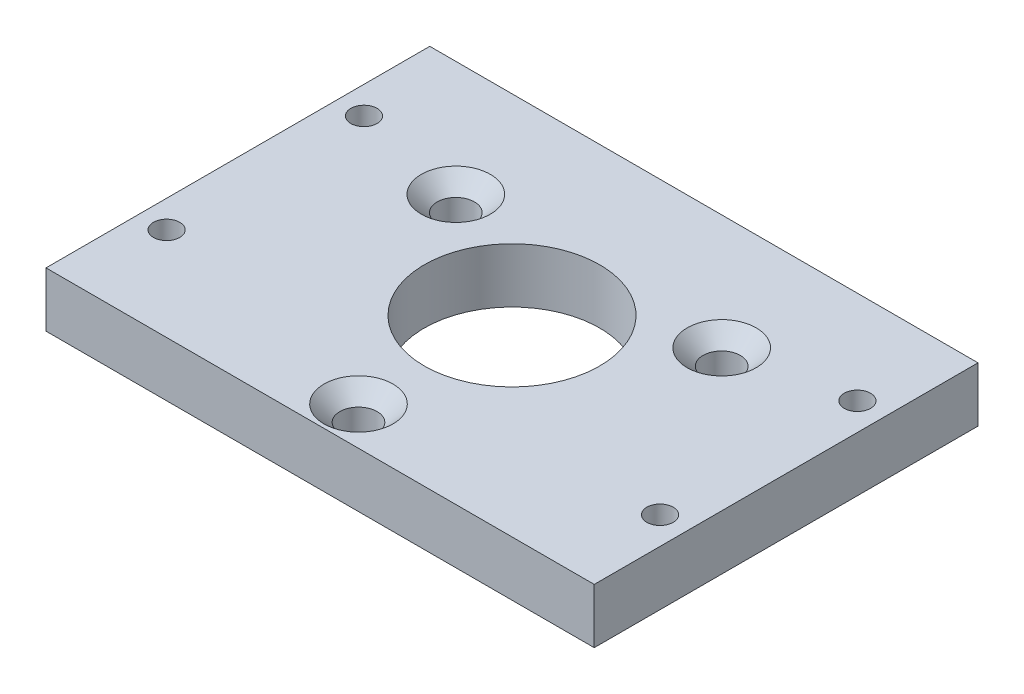
ISO-10303-21;
HEADER;
FILE_DESCRIPTION(('STEP AP214'),'2;1');
FILE_NAME('part.step','',(''),(''),'','','');
FILE_SCHEMA(('AUTOMOTIVE_DESIGN { 1 0 10303 214 1 1 1 1 }'));
ENDSEC;
DATA;
#1=APPLICATION_CONTEXT('core data for automotive mechanical design processes');
#2=APPLICATION_PROTOCOL_DEFINITION('international standard','automotive_design',2000,#1);
#3=PRODUCT_CONTEXT('',#1,'mechanical');
#4=PRODUCT('Part','Part','',(#3));
#5=PRODUCT_RELATED_PRODUCT_CATEGORY('part','',(#4));
#6=PRODUCT_DEFINITION_FORMATION('','',#4);
#7=PRODUCT_DEFINITION_CONTEXT('part definition',#1,'design');
#8=PRODUCT_DEFINITION('design','',#6,#7);
#9=PRODUCT_DEFINITION_SHAPE('','',#8);
#10=(LENGTH_UNIT() NAMED_UNIT(*) SI_UNIT(.MILLI.,.METRE.));
#11=(NAMED_UNIT(*) PLANE_ANGLE_UNIT() SI_UNIT($,.RADIAN.));
#12=(NAMED_UNIT(*) SI_UNIT($,.STERADIAN.) SOLID_ANGLE_UNIT());
#13=UNCERTAINTY_MEASURE_WITH_UNIT(LENGTH_MEASURE(1.E-05),#10,'distance_accuracy_value','');
#14=(GEOMETRIC_REPRESENTATION_CONTEXT(3) GLOBAL_UNCERTAINTY_ASSIGNED_CONTEXT((#13)) GLOBAL_UNIT_ASSIGNED_CONTEXT((#10,
#11,#12)) REPRESENTATION_CONTEXT('',''));
#15=CARTESIAN_POINT('',(0.,0.,0.));
#16=DIRECTION('',(0.,0.,1.));
#17=DIRECTION('',(1.,0.,0.));
#18=AXIS2_PLACEMENT_3D('',#15,#16,#17);
#19=CARTESIAN_POINT('',(0.,5.,0.));
#20=DIRECTION('',(0.,1.,0.));
#21=DIRECTION('',(0.,0.,1.));
#22=AXIS2_PLACEMENT_3D('',#19,#20,#21);
#23=PLANE('',#22);
#24=CARTESIAN_POINT('',(-22.5,5.,9.));
#25=DIRECTION('',(0.,-1.,0.));
#26=DIRECTION('',(0.,0.,-1.));
#27=AXIS2_PLACEMENT_3D('',#24,#25,#26);
#28=CIRCLE('',#27,1.2);
#29=CARTESIAN_POINT('',(-22.5,5.,7.8));
#30=VERTEX_POINT('',#29);
#31=EDGE_CURVE('E186',#30,#30,#28,.T.);
#32=ORIENTED_EDGE('',*,*,#31,.T.);
#33=EDGE_LOOP('',(#32));
#34=FACE_BOUND('',#33,.T.);
#35=CARTESIAN_POINT('',(-22.5,5.,-9.));
#36=DIRECTION('',(0.,-1.,0.));
#37=DIRECTION('',(0.,0.,-1.));
#38=AXIS2_PLACEMENT_3D('',#35,#36,#37);
#39=CIRCLE('',#38,1.2);
#40=CARTESIAN_POINT('',(-22.5,5.,-10.2));
#41=VERTEX_POINT('',#40);
#42=EDGE_CURVE('E177',#41,#41,#39,.T.);
#43=ORIENTED_EDGE('',*,*,#42,.T.);
#44=EDGE_LOOP('',(#43));
#45=FACE_BOUND('',#44,.T.);
#46=CARTESIAN_POINT('',(22.5,5.,-9.));
#47=DIRECTION('',(0.,-1.,0.));
#48=DIRECTION('',(0.,0.,-1.));
#49=AXIS2_PLACEMENT_3D('',#46,#47,#48);
#50=CIRCLE('',#49,1.2);
#51=CARTESIAN_POINT('',(22.5,5.,-10.2));
#52=VERTEX_POINT('',#51);
#53=EDGE_CURVE('E168',#52,#52,#50,.T.);
#54=ORIENTED_EDGE('',*,*,#53,.T.);
#55=EDGE_LOOP('',(#54));
#56=FACE_BOUND('',#55,.T.);
#57=CARTESIAN_POINT('',(22.5,5.,9.));
#58=DIRECTION('',(0.,-1.,0.));
#59=DIRECTION('',(0.,0.,-1.));
#60=AXIS2_PLACEMENT_3D('',#57,#58,#59);
#61=CIRCLE('',#60,1.2);
#62=CARTESIAN_POINT('',(22.5,5.,7.8));
#63=VERTEX_POINT('',#62);
#64=EDGE_CURVE('E159',#63,#63,#61,.T.);
#65=ORIENTED_EDGE('',*,*,#64,.T.);
#66=EDGE_LOOP('',(#65));
#67=FACE_BOUND('',#66,.T.);
#68=CARTESIAN_POINT('',(12.1243556529821,5.,-7.00000000000002));
#69=DIRECTION('',(0.,1.,0.));
#70=DIRECTION('',(0.,0.,1.));
#71=AXIS2_PLACEMENT_3D('',#68,#69,#70);
#72=CIRCLE('',#71,3.15);
#73=CARTESIAN_POINT('',(12.1243556529821,5.,-3.85000000000002));
#74=VERTEX_POINT('',#73);
#75=EDGE_CURVE('E156',#74,#74,#72,.T.);
#76=ORIENTED_EDGE('',*,*,#75,.F.);
#77=EDGE_LOOP('',(#76));
#78=FACE_BOUND('',#77,.T.);
#79=CARTESIAN_POINT('',(1.05644659686988E-12,5.,14.));
#80=DIRECTION('',(0.,1.,0.));
#81=DIRECTION('',(0.,0.,1.));
#82=AXIS2_PLACEMENT_3D('',#79,#80,#81);
#83=CIRCLE('',#82,3.15);
#84=CARTESIAN_POINT('',(1.05644659686988E-12,5.,17.15));
#85=VERTEX_POINT('',#84);
#86=EDGE_CURVE('E147',#85,#85,#83,.T.);
#87=ORIENTED_EDGE('',*,*,#86,.F.);
#88=EDGE_LOOP('',(#87));
#89=FACE_BOUND('',#88,.T.);
#90=CARTESIAN_POINT('',(-12.1243556529817,5.,-6.99999999999909));
#91=DIRECTION('',(0.,1.,0.));
#92=DIRECTION('',(0.,0.,1.));
#93=AXIS2_PLACEMENT_3D('',#90,#91,#92);
#94=CIRCLE('',#93,3.15);
#95=CARTESIAN_POINT('',(-12.1243556529817,5.,-3.84999999999909));
#96=VERTEX_POINT('',#95);
#97=EDGE_CURVE('E138',#96,#96,#94,.T.);
#98=ORIENTED_EDGE('',*,*,#97,.F.);
#99=EDGE_LOOP('',(#98));
#100=FACE_BOUND('',#99,.T.);
#101=DIRECTION('',(0.,0.,1.));
#102=VECTOR('',#101,1.);
#103=CARTESIAN_POINT('',(-25.,5.,17.5));
#104=LINE('',#103,#102);
#105=CARTESIAN_POINT('',(-25.,5.,-17.5));
#106=VERTEX_POINT('',#105);
#107=CARTESIAN_POINT('',(-25.,5.,17.5));
#108=VERTEX_POINT('',#107);
#109=EDGE_CURVE('E100',#106,#108,#104,.T.);
#110=ORIENTED_EDGE('',*,*,#109,.T.);
#111=DIRECTION('',(1.,0.,0.));
#112=VECTOR('',#111,1.);
#113=CARTESIAN_POINT('',(25.,5.,17.5));
#114=LINE('',#113,#112);
#115=CARTESIAN_POINT('',(25.,5.,17.5));
#116=VERTEX_POINT('',#115);
#117=EDGE_CURVE('E95',#108,#116,#114,.T.);
#118=ORIENTED_EDGE('',*,*,#117,.T.);
#119=DIRECTION('',(0.,0.,-1.));
#120=VECTOR('',#119,1.);
#121=CARTESIAN_POINT('',(25.,5.,17.5));
#122=LINE('',#121,#120);
#123=CARTESIAN_POINT('',(25.,5.,-17.5));
#124=VERTEX_POINT('',#123);
#125=EDGE_CURVE('E98',#116,#124,#122,.T.);
#126=ORIENTED_EDGE('',*,*,#125,.T.);
#127=DIRECTION('',(-1.,0.,0.));
#128=VECTOR('',#127,1.);
#129=CARTESIAN_POINT('',(25.,5.,-17.5));
#130=LINE('',#129,#128);
#131=EDGE_CURVE('E65',#124,#106,#130,.T.);
#132=ORIENTED_EDGE('',*,*,#131,.T.);
#133=EDGE_LOOP('',(#110,#118,#126,#132));
#134=FACE_BOUND('',#133,.T.);
#135=CARTESIAN_POINT('',(0.,5.,0.));
#136=DIRECTION('',(0.,1.,0.));
#137=DIRECTION('',(0.,0.,1.));
#138=AXIS2_PLACEMENT_3D('',#135,#136,#137);
#139=CIRCLE('',#138,8.);
#140=CARTESIAN_POINT('',(0.,5.,8.));
#141=VERTEX_POINT('',#140);
#142=EDGE_CURVE('E115',#141,#141,#139,.T.);
#143=ORIENTED_EDGE('',*,*,#142,.F.);
#144=EDGE_LOOP('',(#143));
#145=FACE_BOUND('',#144,.T.);
#146=ADVANCED_FACE('F48',(#34,#45,#56,#67,#78,#89,#100,#134,#145),#23,.T.);
#147=CARTESIAN_POINT('',(0.,0.,0.));
#148=DIRECTION('',(0.,1.,0.));
#149=DIRECTION('',(0.,0.,1.));
#150=AXIS2_PLACEMENT_3D('',#147,#148,#149);
#151=PLANE('',#150);
#152=CARTESIAN_POINT('',(-22.5,0.,9.));
#153=DIRECTION('',(0.,-1.,0.));
#154=DIRECTION('',(0.,0.,-1.));
#155=AXIS2_PLACEMENT_3D('',#152,#153,#154);
#156=CIRCLE('',#155,2.2);
#157=CARTESIAN_POINT('',(-22.5,0.,6.8));
#158=VERTEX_POINT('',#157);
#159=EDGE_CURVE('E192',#158,#158,#156,.T.);
#160=ORIENTED_EDGE('',*,*,#159,.F.);
#161=EDGE_LOOP('',(#160));
#162=FACE_BOUND('',#161,.T.);
#163=CARTESIAN_POINT('',(-22.5,0.,-9.));
#164=DIRECTION('',(0.,-1.,0.));
#165=DIRECTION('',(0.,0.,-1.));
#166=AXIS2_PLACEMENT_3D('',#163,#164,#165);
#167=CIRCLE('',#166,2.2);
#168=CARTESIAN_POINT('',(-22.5,0.,-11.2));
#169=VERTEX_POINT('',#168);
#170=EDGE_CURVE('E183',#169,#169,#167,.T.);
#171=ORIENTED_EDGE('',*,*,#170,.F.);
#172=EDGE_LOOP('',(#171));
#173=FACE_BOUND('',#172,.T.);
#174=CARTESIAN_POINT('',(22.5,0.,-9.));
#175=DIRECTION('',(0.,-1.,0.));
#176=DIRECTION('',(0.,0.,-1.));
#177=AXIS2_PLACEMENT_3D('',#174,#175,#176);
#178=CIRCLE('',#177,2.2);
#179=CARTESIAN_POINT('',(22.5,0.,-11.2));
#180=VERTEX_POINT('',#179);
#181=EDGE_CURVE('E174',#180,#180,#178,.T.);
#182=ORIENTED_EDGE('',*,*,#181,.F.);
#183=EDGE_LOOP('',(#182));
#184=FACE_BOUND('',#183,.T.);
#185=CARTESIAN_POINT('',(22.5,0.,9.));
#186=DIRECTION('',(0.,-1.,0.));
#187=DIRECTION('',(0.,0.,-1.));
#188=AXIS2_PLACEMENT_3D('',#185,#186,#187);
#189=CIRCLE('',#188,2.2);
#190=CARTESIAN_POINT('',(22.5,0.,6.8));
#191=VERTEX_POINT('',#190);
#192=EDGE_CURVE('E165',#191,#191,#189,.T.);
#193=ORIENTED_EDGE('',*,*,#192,.F.);
#194=EDGE_LOOP('',(#193));
#195=FACE_BOUND('',#194,.T.);
#196=CARTESIAN_POINT('',(12.1243556529821,0.,-7.00000000000002));
#197=DIRECTION('',(0.,1.,0.));
#198=DIRECTION('',(0.,0.,1.));
#199=AXIS2_PLACEMENT_3D('',#196,#197,#198);
#200=CIRCLE('',#199,1.7);
#201=CARTESIAN_POINT('',(12.1243556529821,0.,-5.30000000000003));
#202=VERTEX_POINT('',#201);
#203=EDGE_CURVE('E150',#202,#202,#200,.T.);
#204=ORIENTED_EDGE('',*,*,#203,.T.);
#205=EDGE_LOOP('',(#204));
#206=FACE_BOUND('',#205,.T.);
#207=CARTESIAN_POINT('',(1.05644659686988E-12,0.,14.));
#208=DIRECTION('',(0.,1.,0.));
#209=DIRECTION('',(0.,0.,1.));
#210=AXIS2_PLACEMENT_3D('',#207,#208,#209);
#211=CIRCLE('',#210,1.7);
#212=CARTESIAN_POINT('',(1.05644659686988E-12,0.,15.7));
#213=VERTEX_POINT('',#212);
#214=EDGE_CURVE('E141',#213,#213,#211,.T.);
#215=ORIENTED_EDGE('',*,*,#214,.T.);
#216=EDGE_LOOP('',(#215));
#217=FACE_BOUND('',#216,.T.);
#218=CARTESIAN_POINT('',(-12.1243556529817,0.,-6.99999999999909));
#219=DIRECTION('',(0.,1.,0.));
#220=DIRECTION('',(0.,0.,1.));
#221=AXIS2_PLACEMENT_3D('',#218,#219,#220);
#222=CIRCLE('',#221,1.7);
#223=CARTESIAN_POINT('',(-12.1243556529817,0.,-5.2999999999991));
#224=VERTEX_POINT('',#223);
#225=EDGE_CURVE('E130',#224,#224,#222,.T.);
#226=ORIENTED_EDGE('',*,*,#225,.T.);
#227=EDGE_LOOP('',(#226));
#228=FACE_BOUND('',#227,.T.);
#229=DIRECTION('',(0.,0.,1.));
#230=VECTOR('',#229,1.);
#231=CARTESIAN_POINT('',(-25.,0.,17.5));
#232=LINE('',#231,#230);
#233=CARTESIAN_POINT('',(-25.,0.,-17.5));
#234=VERTEX_POINT('',#233);
#235=CARTESIAN_POINT('',(-25.,0.,17.5));
#236=VERTEX_POINT('',#235);
#237=EDGE_CURVE('E112',#234,#236,#232,.T.);
#238=ORIENTED_EDGE('',*,*,#237,.F.);
#239=DIRECTION('',(-1.,0.,0.));
#240=VECTOR('',#239,1.);
#241=CARTESIAN_POINT('',(25.,0.,-17.5));
#242=LINE('',#241,#240);
#243=CARTESIAN_POINT('',(25.,0.,-17.5));
#244=VERTEX_POINT('',#243);
#245=EDGE_CURVE('E88',#244,#234,#242,.T.);
#246=ORIENTED_EDGE('',*,*,#245,.F.);
#247=DIRECTION('',(0.,0.,-1.));
#248=VECTOR('',#247,1.);
#249=CARTESIAN_POINT('',(25.,0.,17.5));
#250=LINE('',#249,#248);
#251=CARTESIAN_POINT('',(25.,0.,17.5));
#252=VERTEX_POINT('',#251);
#253=EDGE_CURVE('E82',#252,#244,#250,.T.);
#254=ORIENTED_EDGE('',*,*,#253,.F.);
#255=DIRECTION('',(1.,0.,0.));
#256=VECTOR('',#255,1.);
#257=CARTESIAN_POINT('',(25.,0.,17.5));
#258=LINE('',#257,#256);
#259=EDGE_CURVE('E104',#236,#252,#258,.T.);
#260=ORIENTED_EDGE('',*,*,#259,.F.);
#261=EDGE_LOOP('',(#238,#246,#254,#260));
#262=FACE_BOUND('',#261,.T.);
#263=CARTESIAN_POINT('',(0.,0.,0.));
#264=DIRECTION('',(0.,1.,0.));
#265=DIRECTION('',(0.,0.,1.));
#266=AXIS2_PLACEMENT_3D('',#263,#264,#265);
#267=CIRCLE('',#266,8.);
#268=CARTESIAN_POINT('',(0.,0.,8.));
#269=VERTEX_POINT('',#268);
#270=EDGE_CURVE('E127',#269,#269,#267,.T.);
#271=ORIENTED_EDGE('',*,*,#270,.T.);
#272=EDGE_LOOP('',(#271));
#273=FACE_BOUND('',#272,.T.);
#274=ADVANCED_FACE('F123',(#162,#173,#184,#195,#206,#217,#228,#262,#273),#151,.F.);
#275=CARTESIAN_POINT('',(-25.,5.,17.5));
#276=DIRECTION('',(1.,0.,0.));
#277=DIRECTION('',(0.,0.,-1.));
#278=AXIS2_PLACEMENT_3D('',#275,#276,#277);
#279=PLANE('',#278);
#280=ORIENTED_EDGE('',*,*,#237,.T.);
#281=DIRECTION('',(0.,-1.,0.));
#282=VECTOR('',#281,1.);
#283=CARTESIAN_POINT('',(-25.,5.,17.5));
#284=LINE('',#283,#282);
#285=EDGE_CURVE('E13',#108,#236,#284,.T.);
#286=ORIENTED_EDGE('',*,*,#285,.F.);
#287=ORIENTED_EDGE('',*,*,#109,.F.);
#288=DIRECTION('',(0.,-1.,0.));
#289=VECTOR('',#288,1.);
#290=CARTESIAN_POINT('',(-25.,5.,-17.5));
#291=LINE('',#290,#289);
#292=EDGE_CURVE('E108',#106,#234,#291,.T.);
#293=ORIENTED_EDGE('',*,*,#292,.T.);
#294=EDGE_LOOP('',(#280,#286,#287,#293));
#295=FACE_BOUND('',#294,.T.);
#296=ADVANCED_FACE('F50',(#295),#279,.F.);
#297=CARTESIAN_POINT('',(25.,5.,17.5));
#298=DIRECTION('',(0.,0.,-1.));
#299=DIRECTION('',(-1.,0.,0.));
#300=AXIS2_PLACEMENT_3D('',#297,#298,#299);
#301=PLANE('',#300);
#302=ORIENTED_EDGE('',*,*,#259,.T.);
#303=DIRECTION('',(0.,-1.,0.));
#304=VECTOR('',#303,1.);
#305=CARTESIAN_POINT('',(25.,5.,17.5));
#306=LINE('',#305,#304);
#307=EDGE_CURVE('E57',#116,#252,#306,.T.);
#308=ORIENTED_EDGE('',*,*,#307,.F.);
#309=ORIENTED_EDGE('',*,*,#117,.F.);
#310=ORIENTED_EDGE('',*,*,#285,.T.);
#311=EDGE_LOOP('',(#302,#308,#309,#310));
#312=FACE_BOUND('',#311,.T.);
#313=ADVANCED_FACE('F103',(#312),#301,.F.);
#314=CARTESIAN_POINT('',(25.,5.,17.5));
#315=DIRECTION('',(-1.,0.,0.));
#316=DIRECTION('',(0.,0.,1.));
#317=AXIS2_PLACEMENT_3D('',#314,#315,#316);
#318=PLANE('',#317);
#319=ORIENTED_EDGE('',*,*,#253,.T.);
#320=DIRECTION('',(0.,-1.,0.));
#321=VECTOR('',#320,1.);
#322=CARTESIAN_POINT('',(25.,5.,-17.5));
#323=LINE('',#322,#321);
#324=EDGE_CURVE('E105',#124,#244,#323,.T.);
#325=ORIENTED_EDGE('',*,*,#324,.F.);
#326=ORIENTED_EDGE('',*,*,#125,.F.);
#327=ORIENTED_EDGE('',*,*,#307,.T.);
#328=EDGE_LOOP('',(#319,#325,#326,#327));
#329=FACE_BOUND('',#328,.T.);
#330=ADVANCED_FACE('F106',(#329),#318,.F.);
#331=CARTESIAN_POINT('',(25.,5.,-17.5));
#332=DIRECTION('',(0.,0.,1.));
#333=DIRECTION('',(1.,0.,0.));
#334=AXIS2_PLACEMENT_3D('',#331,#332,#333);
#335=PLANE('',#334);
#336=ORIENTED_EDGE('',*,*,#245,.T.);
#337=ORIENTED_EDGE('',*,*,#292,.F.);
#338=ORIENTED_EDGE('',*,*,#131,.F.);
#339=ORIENTED_EDGE('',*,*,#324,.T.);
#340=EDGE_LOOP('',(#336,#337,#338,#339));
#341=FACE_BOUND('',#340,.T.);
#342=ADVANCED_FACE('F120',(#341),#335,.F.);
#343=CARTESIAN_POINT('',(0.,5.,0.));
#344=DIRECTION('',(0.,-1.,0.));
#345=DIRECTION('',(0.,0.,-1.));
#346=AXIS2_PLACEMENT_3D('',#343,#344,#345);
#347=CYLINDRICAL_SURFACE('',#346,8.);
#348=ORIENTED_EDGE('',*,*,#142,.T.);
#349=EDGE_LOOP('',(#348));
#350=FACE_BOUND('',#349,.T.);
#351=ORIENTED_EDGE('',*,*,#270,.F.);
#352=EDGE_LOOP('',(#351));
#353=FACE_BOUND('',#352,.T.);
#354=ADVANCED_FACE('F217',(#350,#353),#347,.F.);
#355=CARTESIAN_POINT('',(-12.1243556529817,5.,-6.99999999999909));
#356=DIRECTION('',(0.,1.,0.));
#357=DIRECTION('',(0.,0.,1.));
#358=AXIS2_PLACEMENT_3D('',#355,#356,#357);
#359=CYLINDRICAL_SURFACE('',#358,1.7);
#360=ORIENTED_EDGE('',*,*,#225,.F.);
#361=EDGE_LOOP('',(#360));
#362=FACE_BOUND('',#361,.T.);
#363=CARTESIAN_POINT('',(-12.1243556529817,3.55,-6.99999999999909));
#364=DIRECTION('',(0.,1.,0.));
#365=DIRECTION('',(0.,0.,1.));
#366=AXIS2_PLACEMENT_3D('',#363,#364,#365);
#367=CIRCLE('',#366,1.7);
#368=CARTESIAN_POINT('',(-12.1243556529817,3.55,-5.29999999999909));
#369=VERTEX_POINT('',#368);
#370=EDGE_CURVE('E135',#369,#369,#367,.T.);
#371=ORIENTED_EDGE('',*,*,#370,.T.);
#372=EDGE_LOOP('',(#371));
#373=FACE_BOUND('',#372,.T.);
#374=ADVANCED_FACE('F213',(#362,#373),#359,.F.);
#375=CARTESIAN_POINT('',(-12.1243556529817,5.,-6.99999999999909));
#376=DIRECTION('',(0.,1.,0.));
#377=DIRECTION('',(0.,0.,1.));
#378=AXIS2_PLACEMENT_3D('',#375,#376,#377);
#379=CONICAL_SURFACE('',#378,3.15,0.785398163397449);
#380=ORIENTED_EDGE('',*,*,#370,.F.);
#381=EDGE_LOOP('',(#380));
#382=FACE_BOUND('',#381,.T.);
#383=ORIENTED_EDGE('',*,*,#97,.T.);
#384=EDGE_LOOP('',(#383));
#385=FACE_BOUND('',#384,.T.);
#386=ADVANCED_FACE('F216',(#382,#385),#379,.F.);
#387=CARTESIAN_POINT('',(1.05644659686988E-12,5.,14.));
#388=DIRECTION('',(0.,1.,0.));
#389=DIRECTION('',(0.,0.,1.));
#390=AXIS2_PLACEMENT_3D('',#387,#388,#389);
#391=CYLINDRICAL_SURFACE('',#390,1.7);
#392=ORIENTED_EDGE('',*,*,#214,.F.);
#393=EDGE_LOOP('',(#392));
#394=FACE_BOUND('',#393,.T.);
#395=CARTESIAN_POINT('',(1.05644659686988E-12,3.55,14.));
#396=DIRECTION('',(0.,1.,0.));
#397=DIRECTION('',(0.,0.,1.));
#398=AXIS2_PLACEMENT_3D('',#395,#396,#397);
#399=CIRCLE('',#398,1.7);
#400=CARTESIAN_POINT('',(1.05644659686988E-12,3.55,15.7));
#401=VERTEX_POINT('',#400);
#402=EDGE_CURVE('E144',#401,#401,#399,.T.);
#403=ORIENTED_EDGE('',*,*,#402,.T.);
#404=EDGE_LOOP('',(#403));
#405=FACE_BOUND('',#404,.T.);
#406=ADVANCED_FACE('F223',(#394,#405),#391,.F.);
#407=CARTESIAN_POINT('',(1.05644659686988E-12,5.,14.));
#408=DIRECTION('',(0.,1.,0.));
#409=DIRECTION('',(0.,0.,1.));
#410=AXIS2_PLACEMENT_3D('',#407,#408,#409);
#411=CONICAL_SURFACE('',#410,3.15,0.785398163397449);
#412=ORIENTED_EDGE('',*,*,#402,.F.);
#413=EDGE_LOOP('',(#412));
#414=FACE_BOUND('',#413,.T.);
#415=ORIENTED_EDGE('',*,*,#86,.T.);
#416=EDGE_LOOP('',(#415));
#417=FACE_BOUND('',#416,.T.);
#418=ADVANCED_FACE('F344',(#414,#417),#411,.F.);
#419=CARTESIAN_POINT('',(12.1243556529821,5.,-7.00000000000002));
#420=DIRECTION('',(0.,1.,0.));
#421=DIRECTION('',(0.,0.,1.));
#422=AXIS2_PLACEMENT_3D('',#419,#420,#421);
#423=CYLINDRICAL_SURFACE('',#422,1.7);
#424=ORIENTED_EDGE('',*,*,#203,.F.);
#425=EDGE_LOOP('',(#424));
#426=FACE_BOUND('',#425,.T.);
#427=CARTESIAN_POINT('',(12.1243556529821,3.55,-7.00000000000002));
#428=DIRECTION('',(0.,1.,0.));
#429=DIRECTION('',(0.,0.,1.));
#430=AXIS2_PLACEMENT_3D('',#427,#428,#429);
#431=CIRCLE('',#430,1.7);
#432=CARTESIAN_POINT('',(12.1243556529821,3.55,-5.30000000000002));
#433=VERTEX_POINT('',#432);
#434=EDGE_CURVE('E153',#433,#433,#431,.T.);
#435=ORIENTED_EDGE('',*,*,#434,.T.);
#436=EDGE_LOOP('',(#435));
#437=FACE_BOUND('',#436,.T.);
#438=ADVANCED_FACE('F340',(#426,#437),#423,.F.);
#439=CARTESIAN_POINT('',(12.1243556529821,5.,-7.00000000000002));
#440=DIRECTION('',(0.,1.,0.));
#441=DIRECTION('',(0.,0.,1.));
#442=AXIS2_PLACEMENT_3D('',#439,#440,#441);
#443=CONICAL_SURFACE('',#442,3.15,0.785398163397449);
#444=ORIENTED_EDGE('',*,*,#434,.F.);
#445=EDGE_LOOP('',(#444));
#446=FACE_BOUND('',#445,.T.);
#447=ORIENTED_EDGE('',*,*,#75,.T.);
#448=EDGE_LOOP('',(#447));
#449=FACE_BOUND('',#448,.T.);
#450=ADVANCED_FACE('F262',(#446,#449),#443,.F.);
#451=CARTESIAN_POINT('',(22.5,0.,9.));
#452=DIRECTION('',(0.,-1.,0.));
#453=DIRECTION('',(0.,0.,-1.));
#454=AXIS2_PLACEMENT_3D('',#451,#452,#453);
#455=CYLINDRICAL_SURFACE('',#454,1.2);
#456=ORIENTED_EDGE('',*,*,#64,.F.);
#457=EDGE_LOOP('',(#456));
#458=FACE_BOUND('',#457,.T.);
#459=CARTESIAN_POINT('',(22.5,1.,9.));
#460=DIRECTION('',(0.,-1.,0.));
#461=DIRECTION('',(0.,0.,-1.));
#462=AXIS2_PLACEMENT_3D('',#459,#460,#461);
#463=CIRCLE('',#462,1.2);
#464=CARTESIAN_POINT('',(22.5,1.,7.8));
#465=VERTEX_POINT('',#464);
#466=EDGE_CURVE('E162',#465,#465,#463,.T.);
#467=ORIENTED_EDGE('',*,*,#466,.T.);
#468=EDGE_LOOP('',(#467));
#469=FACE_BOUND('',#468,.T.);
#470=ADVANCED_FACE('F256',(#458,#469),#455,.F.);
#471=CARTESIAN_POINT('',(22.5,0.,9.));
#472=DIRECTION('',(0.,-1.,0.));
#473=DIRECTION('',(0.,0.,-1.));
#474=AXIS2_PLACEMENT_3D('',#471,#472,#473);
#475=CONICAL_SURFACE('',#474,2.2,0.785398163397449);
#476=ORIENTED_EDGE('',*,*,#466,.F.);
#477=EDGE_LOOP('',(#476));
#478=FACE_BOUND('',#477,.T.);
#479=ORIENTED_EDGE('',*,*,#192,.T.);
#480=EDGE_LOOP('',(#479));
#481=FACE_BOUND('',#480,.T.);
#482=ADVANCED_FACE('F261',(#478,#481),#475,.F.);
#483=CARTESIAN_POINT('',(22.5,0.,-9.));
#484=DIRECTION('',(0.,-1.,0.));
#485=DIRECTION('',(0.,0.,-1.));
#486=AXIS2_PLACEMENT_3D('',#483,#484,#485);
#487=CYLINDRICAL_SURFACE('',#486,1.2);
#488=ORIENTED_EDGE('',*,*,#53,.F.);
#489=EDGE_LOOP('',(#488));
#490=FACE_BOUND('',#489,.T.);
#491=CARTESIAN_POINT('',(22.5,1.,-9.));
#492=DIRECTION('',(0.,-1.,0.));
#493=DIRECTION('',(0.,0.,-1.));
#494=AXIS2_PLACEMENT_3D('',#491,#492,#493);
#495=CIRCLE('',#494,1.2);
#496=CARTESIAN_POINT('',(22.5,1.,-10.2));
#497=VERTEX_POINT('',#496);
#498=EDGE_CURVE('E171',#497,#497,#495,.T.);
#499=ORIENTED_EDGE('',*,*,#498,.T.);
#500=EDGE_LOOP('',(#499));
#501=FACE_BOUND('',#500,.T.);
#502=ADVANCED_FACE('F274',(#490,#501),#487,.F.);
#503=CARTESIAN_POINT('',(22.5,0.,-9.));
#504=DIRECTION('',(0.,-1.,0.));
#505=DIRECTION('',(0.,0.,-1.));
#506=AXIS2_PLACEMENT_3D('',#503,#504,#505);
#507=CONICAL_SURFACE('',#506,2.2,0.785398163397449);
#508=ORIENTED_EDGE('',*,*,#498,.F.);
#509=EDGE_LOOP('',(#508));
#510=FACE_BOUND('',#509,.T.);
#511=ORIENTED_EDGE('',*,*,#181,.T.);
#512=EDGE_LOOP('',(#511));
#513=FACE_BOUND('',#512,.T.);
#514=ADVANCED_FACE('F284',(#510,#513),#507,.F.);
#515=CARTESIAN_POINT('',(-22.5,0.,-9.));
#516=DIRECTION('',(0.,-1.,0.));
#517=DIRECTION('',(0.,0.,-1.));
#518=AXIS2_PLACEMENT_3D('',#515,#516,#517);
#519=CYLINDRICAL_SURFACE('',#518,1.2);
#520=ORIENTED_EDGE('',*,*,#42,.F.);
#521=EDGE_LOOP('',(#520));
#522=FACE_BOUND('',#521,.T.);
#523=CARTESIAN_POINT('',(-22.5,1.,-9.));
#524=DIRECTION('',(0.,-1.,0.));
#525=DIRECTION('',(0.,0.,-1.));
#526=AXIS2_PLACEMENT_3D('',#523,#524,#525);
#527=CIRCLE('',#526,1.2);
#528=CARTESIAN_POINT('',(-22.5,1.,-10.2));
#529=VERTEX_POINT('',#528);
#530=EDGE_CURVE('E180',#529,#529,#527,.T.);
#531=ORIENTED_EDGE('',*,*,#530,.T.);
#532=EDGE_LOOP('',(#531));
#533=FACE_BOUND('',#532,.T.);
#534=ADVANCED_FACE('F294',(#522,#533),#519,.F.);
#535=CARTESIAN_POINT('',(-22.5,0.,-9.));
#536=DIRECTION('',(0.,-1.,0.));
#537=DIRECTION('',(0.,0.,-1.));
#538=AXIS2_PLACEMENT_3D('',#535,#536,#537);
#539=CONICAL_SURFACE('',#538,2.2,0.785398163397449);
#540=ORIENTED_EDGE('',*,*,#530,.F.);
#541=EDGE_LOOP('',(#540));
#542=FACE_BOUND('',#541,.T.);
#543=ORIENTED_EDGE('',*,*,#170,.T.);
#544=EDGE_LOOP('',(#543));
#545=FACE_BOUND('',#544,.T.);
#546=ADVANCED_FACE('F304',(#542,#545),#539,.F.);
#547=CARTESIAN_POINT('',(-22.5,0.,9.));
#548=DIRECTION('',(0.,-1.,0.));
#549=DIRECTION('',(0.,0.,-1.));
#550=AXIS2_PLACEMENT_3D('',#547,#548,#549);
#551=CYLINDRICAL_SURFACE('',#550,1.2);
#552=ORIENTED_EDGE('',*,*,#31,.F.);
#553=EDGE_LOOP('',(#552));
#554=FACE_BOUND('',#553,.T.);
#555=CARTESIAN_POINT('',(-22.5,1.,9.));
#556=DIRECTION('',(0.,-1.,0.));
#557=DIRECTION('',(0.,0.,-1.));
#558=AXIS2_PLACEMENT_3D('',#555,#556,#557);
#559=CIRCLE('',#558,1.2);
#560=CARTESIAN_POINT('',(-22.5,1.,7.8));
#561=VERTEX_POINT('',#560);
#562=EDGE_CURVE('E189',#561,#561,#559,.T.);
#563=ORIENTED_EDGE('',*,*,#562,.T.);
#564=EDGE_LOOP('',(#563));
#565=FACE_BOUND('',#564,.T.);
#566=ADVANCED_FACE('F314',(#554,#565),#551,.F.);
#567=CARTESIAN_POINT('',(-22.5,0.,9.));
#568=DIRECTION('',(0.,-1.,0.));
#569=DIRECTION('',(0.,0.,-1.));
#570=AXIS2_PLACEMENT_3D('',#567,#568,#569);
#571=CONICAL_SURFACE('',#570,2.2,0.785398163397449);
#572=ORIENTED_EDGE('',*,*,#562,.F.);
#573=EDGE_LOOP('',(#572));
#574=FACE_BOUND('',#573,.T.);
#575=ORIENTED_EDGE('',*,*,#159,.T.);
#576=EDGE_LOOP('',(#575));
#577=FACE_BOUND('',#576,.T.);
#578=ADVANCED_FACE('F196',(#574,#577),#571,.F.);
#579=CLOSED_SHELL('',(#146,#274,#296,#313,#330,#342,#354,#374,#386,#406,#418,#438,#450,#470,
#482,#502,#514,#534,#546,#566,#578));
#580=MANIFOLD_SOLID_BREP('B2',#579);
#581=ADVANCED_BREP_SHAPE_REPRESENTATION('',(#18,#580),#14);
#582=SHAPE_DEFINITION_REPRESENTATION(#9,#581);
ENDSEC;
END-ISO-10303-21;
